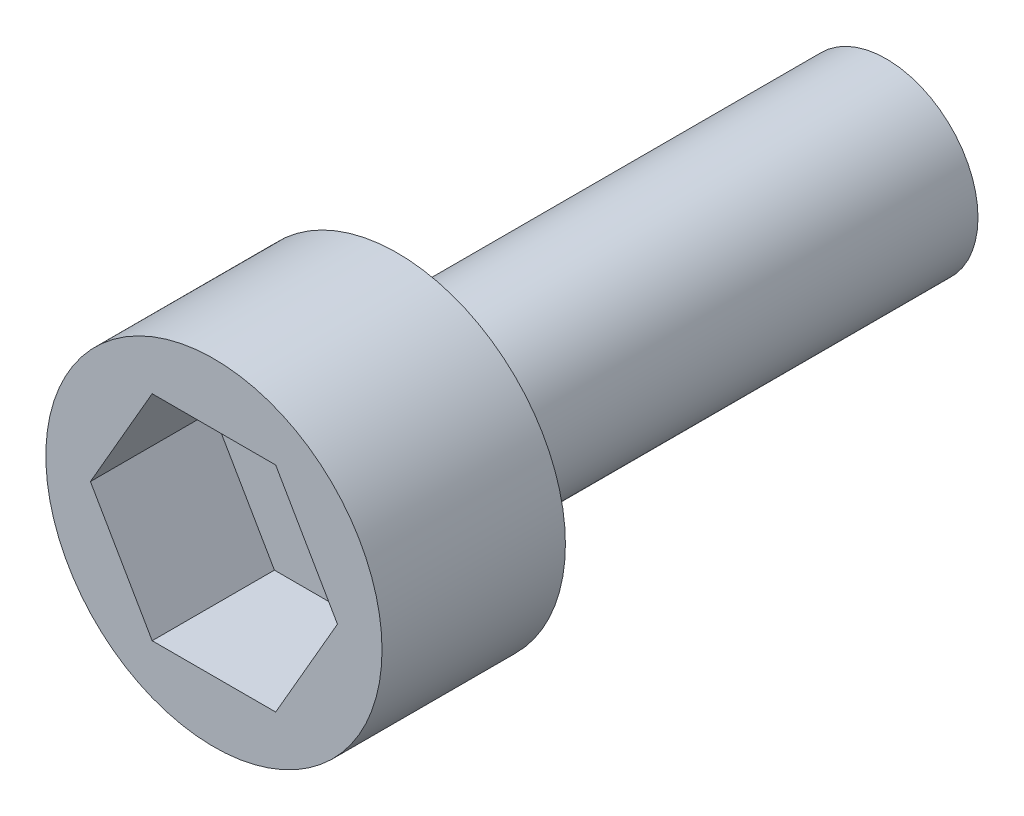
ISO-10303-21;
HEADER;
FILE_DESCRIPTION(('STEP AP214'),'2;1');
FILE_NAME('part.step','',(''),(''),'','','');
FILE_SCHEMA(('AUTOMOTIVE_DESIGN { 1 0 10303 214 1 1 1 1 }'));
ENDSEC;
DATA;
#1=APPLICATION_CONTEXT('core data for automotive mechanical design processes');
#2=APPLICATION_PROTOCOL_DEFINITION('international standard','automotive_design',2000,#1);
#3=PRODUCT_CONTEXT('',#1,'mechanical');
#4=PRODUCT('Part','Part','',(#3));
#5=PRODUCT_RELATED_PRODUCT_CATEGORY('part','',(#4));
#6=PRODUCT_DEFINITION_FORMATION('','',#4);
#7=PRODUCT_DEFINITION_CONTEXT('part definition',#1,'design');
#8=PRODUCT_DEFINITION('design','',#6,#7);
#9=PRODUCT_DEFINITION_SHAPE('','',#8);
#10=(LENGTH_UNIT() NAMED_UNIT(*) SI_UNIT(.MILLI.,.METRE.));
#11=(NAMED_UNIT(*) PLANE_ANGLE_UNIT() SI_UNIT($,.RADIAN.));
#12=(NAMED_UNIT(*) SI_UNIT($,.STERADIAN.) SOLID_ANGLE_UNIT());
#13=UNCERTAINTY_MEASURE_WITH_UNIT(LENGTH_MEASURE(1.E-05),#10,'distance_accuracy_value','');
#14=(GEOMETRIC_REPRESENTATION_CONTEXT(3) GLOBAL_UNCERTAINTY_ASSIGNED_CONTEXT((#13)) GLOBAL_UNIT_ASSIGNED_CONTEXT((#10,
#11,#12)) REPRESENTATION_CONTEXT('',''));
#15=CARTESIAN_POINT('',(0.,0.,0.));
#16=DIRECTION('',(0.,0.,1.));
#17=DIRECTION('',(1.,0.,0.));
#18=AXIS2_PLACEMENT_3D('',#15,#16,#17);
#19=CARTESIAN_POINT('',(0.,0.,8.));
#20=DIRECTION('',(0.,0.,-1.));
#21=DIRECTION('',(-1.,0.,0.));
#22=AXIS2_PLACEMENT_3D('',#19,#20,#21);
#23=CYLINDRICAL_SURFACE('',#22,1.5);
#24=CARTESIAN_POINT('',(0.,0.,8.));
#25=DIRECTION('',(0.,0.,1.));
#26=DIRECTION('',(1.,0.,0.));
#27=AXIS2_PLACEMENT_3D('',#24,#25,#26);
#28=CIRCLE('',#27,1.5);
#29=CARTESIAN_POINT('',(1.5,0.,8.));
#30=VERTEX_POINT('',#29);
#31=EDGE_CURVE('E11',#30,#30,#28,.T.);
#32=ORIENTED_EDGE('',*,*,#31,.F.);
#33=EDGE_LOOP('',(#32));
#34=FACE_BOUND('',#33,.T.);
#35=CARTESIAN_POINT('',(0.,0.,0.));
#36=DIRECTION('',(0.,0.,1.));
#37=DIRECTION('',(1.,0.,0.));
#38=AXIS2_PLACEMENT_3D('',#35,#36,#37);
#39=CIRCLE('',#38,1.5);
#40=CARTESIAN_POINT('',(1.5,0.,0.));
#41=VERTEX_POINT('',#40);
#42=EDGE_CURVE('E42',#41,#41,#39,.T.);
#43=ORIENTED_EDGE('',*,*,#42,.T.);
#44=EDGE_LOOP('',(#43));
#45=FACE_BOUND('',#44,.T.);
#46=ADVANCED_FACE('F39',(#34,#45),#23,.T.);
#47=CARTESIAN_POINT('',(0.,0.,0.));
#48=DIRECTION('',(0.,0.,1.));
#49=DIRECTION('',(1.,0.,0.));
#50=AXIS2_PLACEMENT_3D('',#47,#48,#49);
#51=PLANE('',#50);
#52=ORIENTED_EDGE('',*,*,#42,.F.);
#53=EDGE_LOOP('',(#52));
#54=FACE_BOUND('',#53,.T.);
#55=ADVANCED_FACE('F170',(#54),#51,.F.);
#56=CARTESIAN_POINT('',(0.,0.,11.));
#57=DIRECTION('',(0.,0.,-1.));
#58=DIRECTION('',(-1.,0.,0.));
#59=AXIS2_PLACEMENT_3D('',#56,#57,#58);
#60=CYLINDRICAL_SURFACE('',#59,2.75);
#61=CARTESIAN_POINT('',(0.,0.,11.));
#62=DIRECTION('',(0.,0.,1.));
#63=DIRECTION('',(1.,0.,0.));
#64=AXIS2_PLACEMENT_3D('',#61,#62,#63);
#65=CIRCLE('',#64,2.75);
#66=CARTESIAN_POINT('',(2.75,0.,11.));
#67=VERTEX_POINT('',#66);
#68=EDGE_CURVE('E146',#67,#67,#65,.T.);
#69=ORIENTED_EDGE('',*,*,#68,.F.);
#70=EDGE_LOOP('',(#69));
#71=FACE_BOUND('',#70,.T.);
#72=CARTESIAN_POINT('',(0.,0.,8.));
#73=DIRECTION('',(0.,0.,1.));
#74=DIRECTION('',(1.,0.,0.));
#75=AXIS2_PLACEMENT_3D('',#72,#73,#74);
#76=CIRCLE('',#75,2.75);
#77=CARTESIAN_POINT('',(2.75,0.,8.));
#78=VERTEX_POINT('',#77);
#79=EDGE_CURVE('E140',#78,#78,#76,.T.);
#80=ORIENTED_EDGE('',*,*,#79,.T.);
#81=EDGE_LOOP('',(#80));
#82=FACE_BOUND('',#81,.T.);
#83=ADVANCED_FACE('F152',(#71,#82),#60,.T.);
#84=CARTESIAN_POINT('',(0.,0.,11.));
#85=DIRECTION('',(0.,0.,1.));
#86=DIRECTION('',(1.,0.,0.));
#87=AXIS2_PLACEMENT_3D('',#84,#85,#86);
#88=PLANE('',#87);
#89=DIRECTION('',(0.5,0.866025403784439,0.));
#90=VECTOR('',#89,1.);
#91=CARTESIAN_POINT('',(1.01036297108185,-1.75,11.));
#92=LINE('',#91,#90);
#93=CARTESIAN_POINT('',(1.01036297108185,-1.75,11.));
#94=VERTEX_POINT('',#93);
#95=CARTESIAN_POINT('',(2.02072594216369,0.,11.));
#96=VERTEX_POINT('',#95);
#97=EDGE_CURVE('E53',#94,#96,#92,.T.);
#98=ORIENTED_EDGE('',*,*,#97,.F.);
#99=DIRECTION('',(1.,0.,0.));
#100=VECTOR('',#99,1.);
#101=CARTESIAN_POINT('',(-1.01036297108185,-1.75,11.));
#102=LINE('',#101,#100);
#103=CARTESIAN_POINT('',(-1.01036297108185,-1.75,11.));
#104=VERTEX_POINT('',#103);
#105=EDGE_CURVE('E136',#104,#94,#102,.T.);
#106=ORIENTED_EDGE('',*,*,#105,.F.);
#107=DIRECTION('',(0.5,-0.866025403784439,0.));
#108=VECTOR('',#107,1.);
#109=CARTESIAN_POINT('',(-2.02072594216369,0.,11.));
#110=LINE('',#109,#108);
#111=CARTESIAN_POINT('',(-2.02072594216369,0.,11.));
#112=VERTEX_POINT('',#111);
#113=EDGE_CURVE('E134',#112,#104,#110,.T.);
#114=ORIENTED_EDGE('',*,*,#113,.F.);
#115=DIRECTION('',(-0.5,-0.866025403784439,0.));
#116=VECTOR('',#115,1.);
#117=CARTESIAN_POINT('',(-1.01036297108185,1.75,11.));
#118=LINE('',#117,#116);
#119=CARTESIAN_POINT('',(-1.01036297108185,1.75,11.));
#120=VERTEX_POINT('',#119);
#121=EDGE_CURVE('E101',#120,#112,#118,.T.);
#122=ORIENTED_EDGE('',*,*,#121,.F.);
#123=DIRECTION('',(-1.,0.,0.));
#124=VECTOR('',#123,1.);
#125=CARTESIAN_POINT('',(1.01036297108184,1.75,11.));
#126=LINE('',#125,#124);
#127=CARTESIAN_POINT('',(1.01036297108184,1.75,11.));
#128=VERTEX_POINT('',#127);
#129=EDGE_CURVE('E130',#128,#120,#126,.T.);
#130=ORIENTED_EDGE('',*,*,#129,.F.);
#131=DIRECTION('',(-0.5,0.866025403784439,0.));
#132=VECTOR('',#131,1.);
#133=CARTESIAN_POINT('',(2.02072594216369,0.,11.));
#134=LINE('',#133,#132);
#135=EDGE_CURVE('E127',#96,#128,#134,.T.);
#136=ORIENTED_EDGE('',*,*,#135,.F.);
#137=EDGE_LOOP('',(#98,#106,#114,#122,#130,#136));
#138=FACE_BOUND('',#137,.T.);
#139=ORIENTED_EDGE('',*,*,#68,.T.);
#140=EDGE_LOOP('',(#139));
#141=FACE_BOUND('',#140,.T.);
#142=ADVANCED_FACE('F157',(#138,#141),#88,.T.);
#143=CARTESIAN_POINT('',(0.,0.,8.));
#144=DIRECTION('',(0.,0.,1.));
#145=DIRECTION('',(1.,0.,0.));
#146=AXIS2_PLACEMENT_3D('',#143,#144,#145);
#147=PLANE('',#146);
#148=ORIENTED_EDGE('',*,*,#31,.T.);
#149=EDGE_LOOP('',(#148));
#150=FACE_BOUND('',#149,.T.);
#151=ORIENTED_EDGE('',*,*,#79,.F.);
#152=EDGE_LOOP('',(#151));
#153=FACE_BOUND('',#152,.T.);
#154=ADVANCED_FACE('F154',(#150,#153),#147,.F.);
#155=CARTESIAN_POINT('',(1.01036297108185,-1.75,9.));
#156=DIRECTION('',(0.866025403784439,-0.5,0.));
#157=DIRECTION('',(0.5,0.866025403784439,0.));
#158=AXIS2_PLACEMENT_3D('',#155,#156,#157);
#159=PLANE('',#158);
#160=ORIENTED_EDGE('',*,*,#97,.T.);
#161=DIRECTION('',(0.,0.,1.));
#162=VECTOR('',#161,1.);
#163=CARTESIAN_POINT('',(2.02072594216369,0.,9.));
#164=LINE('',#163,#162);
#165=CARTESIAN_POINT('',(2.02072594216369,0.,9.));
#166=VERTEX_POINT('',#165);
#167=EDGE_CURVE('E83',#166,#96,#164,.T.);
#168=ORIENTED_EDGE('',*,*,#167,.F.);
#169=DIRECTION('',(0.5,0.866025403784439,0.));
#170=VECTOR('',#169,1.);
#171=CARTESIAN_POINT('',(1.01036297108185,-1.75,9.));
#172=LINE('',#171,#170);
#173=CARTESIAN_POINT('',(1.01036297108185,-1.75,9.));
#174=VERTEX_POINT('',#173);
#175=EDGE_CURVE('E138',#174,#166,#172,.T.);
#176=ORIENTED_EDGE('',*,*,#175,.F.);
#177=DIRECTION('',(0.,0.,1.));
#178=VECTOR('',#177,1.);
#179=CARTESIAN_POINT('',(1.01036297108185,-1.75,9.));
#180=LINE('',#179,#178);
#181=EDGE_CURVE('E61',#174,#94,#180,.T.);
#182=ORIENTED_EDGE('',*,*,#181,.T.);
#183=EDGE_LOOP('',(#160,#168,#176,#182));
#184=FACE_BOUND('',#183,.T.);
#185=ADVANCED_FACE('F156',(#184),#159,.F.);
#186=CARTESIAN_POINT('',(-1.01036297108185,-1.75,9.));
#187=DIRECTION('',(0.,-1.,0.));
#188=DIRECTION('',(1.,0.,0.));
#189=AXIS2_PLACEMENT_3D('',#186,#187,#188);
#190=PLANE('',#189);
#191=ORIENTED_EDGE('',*,*,#105,.T.);
#192=ORIENTED_EDGE('',*,*,#181,.F.);
#193=DIRECTION('',(1.,0.,0.));
#194=VECTOR('',#193,1.);
#195=CARTESIAN_POINT('',(-1.01036297108185,-1.75,9.));
#196=LINE('',#195,#194);
#197=CARTESIAN_POINT('',(-1.01036297108185,-1.75,9.));
#198=VERTEX_POINT('',#197);
#199=EDGE_CURVE('E113',#198,#174,#196,.T.);
#200=ORIENTED_EDGE('',*,*,#199,.F.);
#201=DIRECTION('',(0.,0.,1.));
#202=VECTOR('',#201,1.);
#203=CARTESIAN_POINT('',(-1.01036297108185,-1.75,9.));
#204=LINE('',#203,#202);
#205=EDGE_CURVE('E105',#198,#104,#204,.T.);
#206=ORIENTED_EDGE('',*,*,#205,.T.);
#207=EDGE_LOOP('',(#191,#192,#200,#206));
#208=FACE_BOUND('',#207,.T.);
#209=ADVANCED_FACE('F164',(#208),#190,.F.);
#210=CARTESIAN_POINT('',(-2.02072594216369,0.,9.));
#211=DIRECTION('',(-0.866025403784439,-0.5,0.));
#212=DIRECTION('',(0.5,-0.866025403784439,0.));
#213=AXIS2_PLACEMENT_3D('',#210,#211,#212);
#214=PLANE('',#213);
#215=ORIENTED_EDGE('',*,*,#113,.T.);
#216=ORIENTED_EDGE('',*,*,#205,.F.);
#217=DIRECTION('',(0.5,-0.866025403784439,0.));
#218=VECTOR('',#217,1.);
#219=CARTESIAN_POINT('',(-2.02072594216369,0.,9.));
#220=LINE('',#219,#218);
#221=CARTESIAN_POINT('',(-2.02072594216369,0.,9.));
#222=VERTEX_POINT('',#221);
#223=EDGE_CURVE('E109',#222,#198,#220,.T.);
#224=ORIENTED_EDGE('',*,*,#223,.F.);
#225=DIRECTION('',(0.,0.,1.));
#226=VECTOR('',#225,1.);
#227=CARTESIAN_POINT('',(-2.02072594216369,0.,9.));
#228=LINE('',#227,#226);
#229=EDGE_CURVE('E94',#222,#112,#228,.T.);
#230=ORIENTED_EDGE('',*,*,#229,.T.);
#231=EDGE_LOOP('',(#215,#216,#224,#230));
#232=FACE_BOUND('',#231,.T.);
#233=ADVANCED_FACE('F110',(#232),#214,.F.);
#234=CARTESIAN_POINT('',(-1.01036297108185,1.75,9.));
#235=DIRECTION('',(-0.866025403784439,0.5,0.));
#236=DIRECTION('',(-0.5,-0.866025403784439,0.));
#237=AXIS2_PLACEMENT_3D('',#234,#235,#236);
#238=PLANE('',#237);
#239=ORIENTED_EDGE('',*,*,#121,.T.);
#240=ORIENTED_EDGE('',*,*,#229,.F.);
#241=DIRECTION('',(-0.5,-0.866025403784439,0.));
#242=VECTOR('',#241,1.);
#243=CARTESIAN_POINT('',(-1.01036297108185,1.75,9.));
#244=LINE('',#243,#242);
#245=CARTESIAN_POINT('',(-1.01036297108185,1.75,9.));
#246=VERTEX_POINT('',#245);
#247=EDGE_CURVE('E98',#246,#222,#244,.T.);
#248=ORIENTED_EDGE('',*,*,#247,.F.);
#249=DIRECTION('',(0.,0.,1.));
#250=VECTOR('',#249,1.);
#251=CARTESIAN_POINT('',(-1.01036297108185,1.75,9.));
#252=LINE('',#251,#250);
#253=EDGE_CURVE('E106',#246,#120,#252,.T.);
#254=ORIENTED_EDGE('',*,*,#253,.T.);
#255=EDGE_LOOP('',(#239,#240,#248,#254));
#256=FACE_BOUND('',#255,.T.);
#257=ADVANCED_FACE('F96',(#256),#238,.F.);
#258=CARTESIAN_POINT('',(1.01036297108184,1.75,9.));
#259=DIRECTION('',(0.,1.,0.));
#260=DIRECTION('',(-1.,0.,0.));
#261=AXIS2_PLACEMENT_3D('',#258,#259,#260);
#262=PLANE('',#261);
#263=ORIENTED_EDGE('',*,*,#129,.T.);
#264=ORIENTED_EDGE('',*,*,#253,.F.);
#265=DIRECTION('',(-1.,0.,0.));
#266=VECTOR('',#265,1.);
#267=CARTESIAN_POINT('',(1.01036297108184,1.75,9.));
#268=LINE('',#267,#266);
#269=CARTESIAN_POINT('',(1.01036297108184,1.75,9.));
#270=VERTEX_POINT('',#269);
#271=EDGE_CURVE('E119',#270,#246,#268,.T.);
#272=ORIENTED_EDGE('',*,*,#271,.F.);
#273=DIRECTION('',(0.,0.,1.));
#274=VECTOR('',#273,1.);
#275=CARTESIAN_POINT('',(1.01036297108184,1.75,9.));
#276=LINE('',#275,#274);
#277=EDGE_CURVE('E143',#270,#128,#276,.T.);
#278=ORIENTED_EDGE('',*,*,#277,.T.);
#279=EDGE_LOOP('',(#263,#264,#272,#278));
#280=FACE_BOUND('',#279,.T.);
#281=ADVANCED_FACE('F225',(#280),#262,.F.);
#282=CARTESIAN_POINT('',(2.02072594216369,0.,9.));
#283=DIRECTION('',(0.866025403784439,0.5,0.));
#284=DIRECTION('',(-0.5,0.866025403784439,0.));
#285=AXIS2_PLACEMENT_3D('',#282,#283,#284);
#286=PLANE('',#285);
#287=ORIENTED_EDGE('',*,*,#135,.T.);
#288=ORIENTED_EDGE('',*,*,#277,.F.);
#289=DIRECTION('',(-0.5,0.866025403784439,0.));
#290=VECTOR('',#289,1.);
#291=CARTESIAN_POINT('',(2.02072594216369,0.,9.));
#292=LINE('',#291,#290);
#293=EDGE_CURVE('E121',#166,#270,#292,.T.);
#294=ORIENTED_EDGE('',*,*,#293,.F.);
#295=ORIENTED_EDGE('',*,*,#167,.T.);
#296=EDGE_LOOP('',(#287,#288,#294,#295));
#297=FACE_BOUND('',#296,.T.);
#298=ADVANCED_FACE('F234',(#297),#286,.F.);
#299=CARTESIAN_POINT('',(0.,0.,9.));
#300=DIRECTION('',(0.,0.,1.));
#301=DIRECTION('',(1.,0.,0.));
#302=AXIS2_PLACEMENT_3D('',#299,#300,#301);
#303=PLANE('',#302);
#304=ORIENTED_EDGE('',*,*,#175,.T.);
#305=ORIENTED_EDGE('',*,*,#293,.T.);
#306=ORIENTED_EDGE('',*,*,#271,.T.);
#307=ORIENTED_EDGE('',*,*,#247,.T.);
#308=ORIENTED_EDGE('',*,*,#223,.T.);
#309=ORIENTED_EDGE('',*,*,#199,.T.);
#310=EDGE_LOOP('',(#304,#305,#306,#307,#308,#309));
#311=FACE_BOUND('',#310,.T.);
#312=ADVANCED_FACE('F116',(#311),#303,.T.);
#313=CLOSED_SHELL('',(#46,#55,#83,#142,#154,#185,#209,#233,#257,#281,#298,#312));
#314=MANIFOLD_SOLID_BREP('B2',#313);
#315=ADVANCED_BREP_SHAPE_REPRESENTATION('',(#18,#314),#14);
#316=SHAPE_DEFINITION_REPRESENTATION(#9,#315);
ENDSEC;
END-ISO-10303-21;
